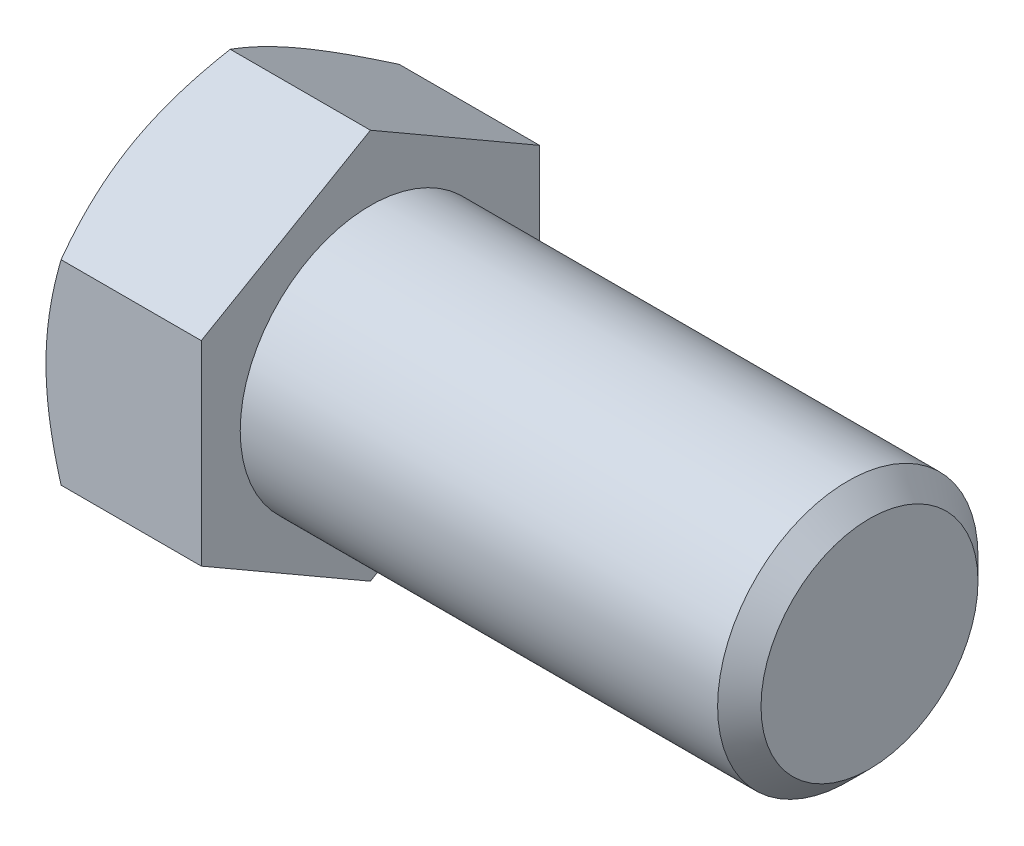
ISO-10303-21;
HEADER;
FILE_DESCRIPTION(('STEP AP214'),'2;1');
FILE_NAME('part.step','',(''),(''),'','','');
FILE_SCHEMA(('AUTOMOTIVE_DESIGN { 1 0 10303 214 1 1 1 1 }'));
ENDSEC;
DATA;
#1=APPLICATION_CONTEXT('core data for automotive mechanical design processes');
#2=APPLICATION_PROTOCOL_DEFINITION('international standard','automotive_design',2000,#1);
#3=PRODUCT_CONTEXT('',#1,'mechanical');
#4=PRODUCT('Part','Part','',(#3));
#5=PRODUCT_RELATED_PRODUCT_CATEGORY('part','',(#4));
#6=PRODUCT_DEFINITION_FORMATION('','',#4);
#7=PRODUCT_DEFINITION_CONTEXT('part definition',#1,'design');
#8=PRODUCT_DEFINITION('design','',#6,#7);
#9=PRODUCT_DEFINITION_SHAPE('','',#8);
#10=(LENGTH_UNIT() NAMED_UNIT(*) SI_UNIT(.MILLI.,.METRE.));
#11=(NAMED_UNIT(*) PLANE_ANGLE_UNIT() SI_UNIT($,.RADIAN.));
#12=(NAMED_UNIT(*) SI_UNIT($,.STERADIAN.) SOLID_ANGLE_UNIT());
#13=UNCERTAINTY_MEASURE_WITH_UNIT(LENGTH_MEASURE(1.E-05),#10,'distance_accuracy_value','');
#14=(GEOMETRIC_REPRESENTATION_CONTEXT(3) GLOBAL_UNCERTAINTY_ASSIGNED_CONTEXT((#13)) GLOBAL_UNIT_ASSIGNED_CONTEXT((#10,
#11,#12)) REPRESENTATION_CONTEXT('',''));
#15=CARTESIAN_POINT('',(0.,0.,0.));
#16=DIRECTION('',(0.,0.,1.));
#17=DIRECTION('',(1.,0.,0.));
#18=AXIS2_PLACEMENT_3D('',#15,#16,#17);
#19=CARTESIAN_POINT('',(0.,6.,0.));
#20=DIRECTION('',(-1.,0.,0.));
#21=DIRECTION('',(0.,0.,1.));
#22=AXIS2_PLACEMENT_3D('',#19,#20,#21);
#23=PLANE('',#22);
#24=CARTESIAN_POINT('',(0.,0.,0.));
#25=DIRECTION('',(-1.,0.,0.));
#26=DIRECTION('',(0.,0.,1.));
#27=AXIS2_PLACEMENT_3D('',#24,#25,#26);
#28=CIRCLE('',#27,6.);
#29=CARTESIAN_POINT('',(0.,0.,6.));
#30=VERTEX_POINT('',#29);
#31=EDGE_CURVE('E161',#30,#30,#28,.T.);
#32=ORIENTED_EDGE('',*,*,#31,.T.);
#33=EDGE_LOOP('',(#32));
#34=FACE_BOUND('',#33,.T.);
#35=DIRECTION('',(0.,0.5,0.866025403784439));
#36=VECTOR('',#35,1.);
#37=CARTESIAN_POINT('',(0.,4.5,-7.79422863405994));
#38=LINE('',#37,#36);
#39=CARTESIAN_POINT('',(0.,4.5,-7.79422863405994));
#40=VERTEX_POINT('',#39);
#41=CARTESIAN_POINT('',(0.,9.,0.));
#42=VERTEX_POINT('',#41);
#43=EDGE_CURVE('E143',#40,#42,#38,.T.);
#44=ORIENTED_EDGE('',*,*,#43,.T.);
#45=DIRECTION('',(0.,-0.5,0.866025403784438));
#46=VECTOR('',#45,1.);
#47=CARTESIAN_POINT('',(0.,9.,0.));
#48=LINE('',#47,#46);
#49=CARTESIAN_POINT('',(0.,4.49999999999999,7.79422863405995));
#50=VERTEX_POINT('',#49);
#51=EDGE_CURVE('E141',#42,#50,#48,.T.);
#52=ORIENTED_EDGE('',*,*,#51,.T.);
#53=DIRECTION('',(0.,-1.,0.));
#54=VECTOR('',#53,1.);
#55=CARTESIAN_POINT('',(0.,4.49999999999999,7.79422863405994));
#56=LINE('',#55,#54);
#57=CARTESIAN_POINT('',(0.,-4.5,7.79422863405994));
#58=VERTEX_POINT('',#57);
#59=EDGE_CURVE('E83',#50,#58,#56,.T.);
#60=ORIENTED_EDGE('',*,*,#59,.T.);
#61=DIRECTION('',(0.,-0.5,-0.866025403784439));
#62=VECTOR('',#61,1.);
#63=CARTESIAN_POINT('',(0.,-4.5,7.79422863405994));
#64=LINE('',#63,#62);
#65=CARTESIAN_POINT('',(0.,-9.,0.));
#66=VERTEX_POINT('',#65);
#67=EDGE_CURVE('E131',#58,#66,#64,.T.);
#68=ORIENTED_EDGE('',*,*,#67,.T.);
#69=DIRECTION('',(0.,0.5,-0.866025403784439));
#70=VECTOR('',#69,1.);
#71=CARTESIAN_POINT('',(0.,-9.,0.));
#72=LINE('',#71,#70);
#73=CARTESIAN_POINT('',(0.,-4.5,-7.79422863405994));
#74=VERTEX_POINT('',#73);
#75=EDGE_CURVE('E137',#66,#74,#72,.T.);
#76=ORIENTED_EDGE('',*,*,#75,.T.);
#77=DIRECTION('',(0.,1.,0.));
#78=VECTOR('',#77,1.);
#79=CARTESIAN_POINT('',(0.,-4.5,-7.79422863405994));
#80=LINE('',#79,#78);
#81=EDGE_CURVE('E148',#74,#40,#80,.T.);
#82=ORIENTED_EDGE('',*,*,#81,.T.);
#83=EDGE_LOOP('',(#44,#52,#60,#68,#76,#82));
#84=FACE_BOUND('',#83,.T.);
#85=ADVANCED_FACE('F68',(#34,#84),#23,.F.);
#86=CARTESIAN_POINT('',(23.,0.,0.));
#87=DIRECTION('',(-1.,0.,0.));
#88=DIRECTION('',(0.,0.,1.));
#89=AXIS2_PLACEMENT_3D('',#86,#87,#88);
#90=PLANE('',#89);
#91=CARTESIAN_POINT('',(23.,0.,0.));
#92=DIRECTION('',(-1.,0.,0.));
#93=DIRECTION('',(0.,0.,1.));
#94=AXIS2_PLACEMENT_3D('',#91,#92,#93);
#95=CIRCLE('',#94,4.99999999999999);
#96=CARTESIAN_POINT('',(23.,0.,4.99999999999999));
#97=VERTEX_POINT('',#96);
#98=EDGE_CURVE('E13',#97,#97,#95,.F.);
#99=ORIENTED_EDGE('',*,*,#98,.T.);
#100=EDGE_LOOP('',(#99));
#101=FACE_BOUND('',#100,.T.);
#102=ADVANCED_FACE('F217',(#101),#90,.F.);
#103=CARTESIAN_POINT('',(0.,0.,0.));
#104=DIRECTION('',(-1.,0.,0.));
#105=DIRECTION('',(0.,0.,1.));
#106=AXIS2_PLACEMENT_3D('',#103,#104,#105);
#107=CYLINDRICAL_SURFACE('',#106,6.);
#108=CARTESIAN_POINT('',(22.,0.,0.));
#109=DIRECTION('',(-1.,0.,0.));
#110=DIRECTION('',(0.,0.,1.));
#111=AXIS2_PLACEMENT_3D('',#108,#109,#110);
#112=CIRCLE('',#111,6.);
#113=CARTESIAN_POINT('',(22.,0.,6.));
#114=VERTEX_POINT('',#113);
#115=EDGE_CURVE('E76',#114,#114,#112,.T.);
#116=ORIENTED_EDGE('',*,*,#115,.T.);
#117=EDGE_LOOP('',(#116));
#118=FACE_BOUND('',#117,.T.);
#119=ORIENTED_EDGE('',*,*,#31,.F.);
#120=EDGE_LOOP('',(#119));
#121=FACE_BOUND('',#120,.T.);
#122=ADVANCED_FACE('F190',(#118,#121),#107,.T.);
#123=CARTESIAN_POINT('',(-10.,4.5,-7.79422863405994));
#124=DIRECTION('',(0.,0.866025403784438,-0.5));
#125=DIRECTION('',(0.,0.5,0.866025403784438));
#126=AXIS2_PLACEMENT_3D('',#123,#124,#125);
#127=PLANE('',#126);
#128=CARTESIAN_POINT('',(-6.46070284750902,4.49988452994616,-7.79442863405994));
#129=CARTESIAN_POINT('',(-6.51780260079582,4.59879950870639,-7.62310286521763));
#130=CARTESIAN_POINT('',(-6.57231094880739,4.69808327761291,-7.45113833310461));
#131=CARTESIAN_POINT('',(-6.67543107497447,4.89745710466197,-7.10581273495618));
#132=CARTESIAN_POINT('',(-6.72404030943128,4.99754749092025,-6.93245110060765));
#133=CARTESIAN_POINT('',(-6.86006515841878,5.29942124506401,-6.40959042095911));
#134=CARTESIAN_POINT('',(-6.9374343657416,5.5023962443257,-6.0580274095716));
#135=CARTESIAN_POINT('',(-7.02815896377191,5.80614440853671,-5.53192015645236));
#136=CARTESIAN_POINT('',(-7.05400379366982,5.90601013280876,-5.35894764807851));
#137=CARTESIAN_POINT('',(-7.09734123100484,6.10619320539383,-5.01222039554591));
#138=CARTESIAN_POINT('',(-7.1148345763996,6.20651051301283,-4.83846572187129));
#139=CARTESIAN_POINT('',(-7.14102570281816,6.40731786054443,-4.49065719341342));
#140=CARTESIAN_POINT('',(-7.14973346561756,6.50780757419777,-4.31660390372779));
#141=CARTESIAN_POINT('',(-7.15816674191882,6.70887983476791,-3.96833653242758));
#142=CARTESIAN_POINT('',(-7.15789253291908,6.80946237872071,-3.79412245594679));
#143=CARTESIAN_POINT('',(-7.14898658076692,6.99750527197464,-3.46842261082873));
#144=CARTESIAN_POINT('',(-7.1414412545191,7.08497889058778,-3.31691385906887));
#145=CARTESIAN_POINT('',(-7.11970366098955,7.25972156379906,-3.01425067081653));
#146=CARTESIAN_POINT('',(-7.1055109222476,7.34699060344639,-2.86309626021962));
#147=CARTESIAN_POINT('',(-7.0532971550531,7.60845956220151,-2.41021873905362));
#148=CARTESIAN_POINT('',(-7.00564707985474,7.78219665888802,-2.10929726043307));
#149=CARTESIAN_POINT('',(-6.88652096473075,8.13151383909343,-1.50426215636062));
#150=CARTESIAN_POINT('',(-6.81453994540648,8.30704934019216,-1.20022574992556));
#151=CARTESIAN_POINT('',(-6.65117273645529,8.65550262811656,-0.596686951176073));
#152=CARTESIAN_POINT('',(-6.55982491838325,8.82842487729215,-0.297176829844864));
#153=CARTESIAN_POINT('',(-6.46070284750902,9.00011547005384,0.000199999999995929));
#154=B_SPLINE_CURVE_WITH_KNOTS('',3,(#128,#129,#130,#131,#132,#133,#134,#135,#136,#137,#138,
#139,#140,#141,#142,#143,#144,#145,#146,#147,#148,#149,#150,#151,#152,#153),.UNSPECIFIED.,.F.,
.F.,(4,2,2,2,2,2,2,2,2,2,2,2,4),(0.,0.617667126704347,1.23559965230367,2.47403233296679,
3.07808164625474,3.6820775743811,4.28538649467425,4.88867677573062,5.41387548857205,
5.93911145618209,6.99032972891176,8.06486213809552,9.13728513994542),.UNSPECIFIED.);
#155=CARTESIAN_POINT('',(-6.46076951545867,4.5,-7.79422863405994));
#156=VERTEX_POINT('',#155);
#157=CARTESIAN_POINT('',(-6.46076951545867,9.,0.));
#158=VERTEX_POINT('',#157);
#159=EDGE_CURVE('E193',#156,#158,#154,.T.);
#160=ORIENTED_EDGE('',*,*,#159,.T.);
#161=DIRECTION('',(1.,0.,0.));
#162=VECTOR('',#161,1.);
#163=CARTESIAN_POINT('',(-10.,9.,0.));
#164=LINE('',#163,#162);
#165=EDGE_CURVE('E91',#158,#42,#164,.T.);
#166=ORIENTED_EDGE('',*,*,#165,.T.);
#167=ORIENTED_EDGE('',*,*,#43,.F.);
#168=DIRECTION('',(1.,0.,0.));
#169=VECTOR('',#168,1.);
#170=CARTESIAN_POINT('',(-10.,4.5,-7.79422863405994));
#171=LINE('',#170,#169);
#172=EDGE_CURVE('E151',#156,#40,#171,.T.);
#173=ORIENTED_EDGE('',*,*,#172,.F.);
#174=EDGE_LOOP('',(#160,#166,#167,#173));
#175=FACE_BOUND('',#174,.T.);
#176=ADVANCED_FACE('F186',(#175),#127,.T.);
#177=CARTESIAN_POINT('',(-10.,-4.5,-7.79422863405994));
#178=DIRECTION('',(0.,0.,-1.));
#179=DIRECTION('',(-1.,0.,0.));
#180=AXIS2_PLACEMENT_3D('',#177,#178,#179);
#181=PLANE('',#180);
#182=CARTESIAN_POINT('',(-3.45013243923555,-11.8871435441502,-7.79422863405994));
#183=CARTESIAN_POINT('',(-3.61513212776838,-11.5453000884677,-7.79422863405994));
#184=CARTESIAN_POINT('',(-3.77847695237742,-11.2026430083419,-7.79422863405994));
#185=CARTESIAN_POINT('',(-4.10091009820773,-10.5152614203984,-7.79422863405994));
#186=CARTESIAN_POINT('',(-4.25999767126696,-10.1705365620552,-7.79422863405994));
#187=CARTESIAN_POINT('',(-4.57381803962259,-9.47669344952864,-7.79422863405994));
#188=CARTESIAN_POINT('',(-4.72852025123507,-9.12756131183755,-7.79422863405994));
#189=CARTESIAN_POINT('',(-5.03121102013885,-8.42640990621833,-7.79422863405994));
#190=CARTESIAN_POINT('',(-5.17919993120749,-8.0743907915851,-7.79422863405994));
#191=CARTESIAN_POINT('',(-5.46834306933042,-7.36275735143967,-7.79422863405994));
#192=CARTESIAN_POINT('',(-5.60939765906331,-7.00310231439271,-7.79422863405994));
#193=CARTESIAN_POINT('',(-5.88034043308964,-6.27953420083924,-7.79422863405994));
#194=CARTESIAN_POINT('',(-6.01022737048032,-5.91562065399723,-7.79422863405994));
#195=CARTESIAN_POINT('',(-6.25530950437768,-5.18371551170913,-7.79422863405994));
#196=CARTESIAN_POINT('',(-6.37053635584792,-4.81573463394478,-7.79422863405994));
#197=CARTESIAN_POINT('',(-6.58252747215586,-4.07455724278535,-7.79422863405994));
#198=CARTESIAN_POINT('',(-6.67929761838976,-3.70136243167834,-7.79422863405994));
#199=CARTESIAN_POINT('',(-6.84964430651716,-2.94942085934435,-7.79422863405994));
#200=CARTESIAN_POINT('',(-6.92321214920422,-2.57067207133666,-7.79422863405994));
#201=CARTESIAN_POINT('',(-7.01245142321804,-1.99925709701334,-7.79422863405994));
#202=CARTESIAN_POINT('',(-7.03868100867892,-1.80821332805513,-7.79422863405994));
#203=CARTESIAN_POINT('',(-7.08358593404042,-1.42524605558091,-7.79422863405994));
#204=CARTESIAN_POINT('',(-7.10226198765831,-1.23332263691501,-7.79422863405994));
#205=CARTESIAN_POINT('',(-7.13155940706448,-0.85004630666443,-7.79422863405994));
#206=CARTESIAN_POINT('',(-7.14222958236774,-0.658697140809862,-7.79422863405994));
#207=CARTESIAN_POINT('',(-7.15545964300746,-0.275719292023764,-7.79422863405994));
#208=CARTESIAN_POINT('',(-7.15801964934033,-0.0840906133049886,-7.79422863405994));
#209=CARTESIAN_POINT('',(-7.1549685763674,0.299049527718677,-7.79422863405994));
#210=CARTESIAN_POINT('',(-7.14935974843619,0.490561007772642,-7.79422863405994));
#211=CARTESIAN_POINT('',(-7.13010910110289,0.873182507881345,-7.79422863405994));
#212=CARTESIAN_POINT('',(-7.1164668456962,1.06429250558109,-7.79422863405994));
#213=CARTESIAN_POINT('',(-7.07382036711238,1.52887914329752,-7.79422863405994));
#214=CARTESIAN_POINT('',(-7.04071364531459,1.80198639890912,-7.79422863405994));
#215=CARTESIAN_POINT('',(-6.95994899366412,2.34602930791573,-7.79422863405994));
#216=CARTESIAN_POINT('',(-6.91228886347717,2.61696462657383,-7.79422863405994));
#217=CARTESIAN_POINT('',(-6.7498724194379,3.42700119689536,-7.79422863405994));
#218=CARTESIAN_POINT('',(-6.61578990490024,3.96227061854245,-7.79422863405994));
#219=CARTESIAN_POINT('',(-6.3849954396195,4.76285070654446,-7.79422863405994));
#220=CARTESIAN_POINT('',(-6.302005675105,5.03235421702641,-7.79422863405994));
#221=CARTESIAN_POINT('',(-6.127850360925,5.56875770212913,-7.79422863405994));
#222=CARTESIAN_POINT('',(-6.03668408016499,5.83565744156602,-7.79422863405994));
#223=CARTESIAN_POINT('',(-5.84812172876184,6.36552011623486,-7.79422863405994));
#224=CARTESIAN_POINT('',(-5.75076386407457,6.62849678660593,-7.79422863405994));
#225=CARTESIAN_POINT('',(-5.55047370592607,7.15221912679046,-7.79422863405994));
#226=CARTESIAN_POINT('',(-5.44754334298111,7.41296553345428,-7.79422863405994));
#227=CARTESIAN_POINT('',(-5.34234986747821,7.67277402949574,-7.79422863405994));
#228=B_SPLINE_CURVE_WITH_KNOTS('',3,(#182,#183,#184,#185,#186,#187,#188,#189,#190,#191,#192,
#193,#194,#195,#196,#197,#198,#199,#200,#201,#202,#203,#204,#205,#206,#207,#208,#209,#210,#211,
#212,#213,#214,#215,#216,#217,#218,#219,#220,#221,#222,#223,#224,#225,#226,#227),.UNSPECIFIED.,
.F.,.F.,(4,2,2,2,2,2,2,2,2,2,2,2,2,2,2,2,2,2,2,2,2,2,4),(0.,1.13875897147266,2.27771676946099,
3.42327579508272,4.56877438176784,5.72760998623509,6.88657481069739,8.04299304897516,
9.19904216616966,10.3555242053526,10.9339061906066,11.5122335129944,12.0870056330268,
12.6617691779371,13.2363743449013,13.811010700743,14.6358607774909,15.4608356253718,
17.1139754294432,17.9598868064326,18.8058738952383,19.6470698105752,20.4879761469829),.UNSPECIFIED.);
#229=CARTESIAN_POINT('',(-6.46076951545867,-4.5,-7.79422863405994));
#230=VERTEX_POINT('',#229);
#231=EDGE_CURVE('E198',#230,#156,#228,.T.);
#232=ORIENTED_EDGE('',*,*,#231,.T.);
#233=ORIENTED_EDGE('',*,*,#172,.T.);
#234=ORIENTED_EDGE('',*,*,#81,.F.);
#235=DIRECTION('',(1.,0.,0.));
#236=VECTOR('',#235,1.);
#237=CARTESIAN_POINT('',(-10.,-4.5,-7.79422863405994));
#238=LINE('',#237,#236);
#239=EDGE_CURVE('E154',#230,#74,#238,.T.);
#240=ORIENTED_EDGE('',*,*,#239,.F.);
#241=EDGE_LOOP('',(#232,#233,#234,#240));
#242=FACE_BOUND('',#241,.T.);
#243=ADVANCED_FACE('F189',(#242),#181,.T.);
#244=CARTESIAN_POINT('',(-10.,-9.,0.));
#245=DIRECTION('',(0.,-0.866025403784439,-0.5));
#246=DIRECTION('',(0.,0.5,-0.866025403784439));
#247=AXIS2_PLACEMENT_3D('',#244,#245,#246);
#248=PLANE('',#247);
#249=CARTESIAN_POINT('',(-6.46070284750902,-9.00011547005384,0.000200000000000963));
#250=CARTESIAN_POINT('',(-6.51780260079582,-8.9012004912936,-0.171125768842318));
#251=CARTESIAN_POINT('',(-6.57231094880739,-8.80191672238709,-0.343090300955334));
#252=CARTESIAN_POINT('',(-6.67543107497447,-8.60254289533802,-0.68841589910376));
#253=CARTESIAN_POINT('',(-6.72404030943128,-8.50245250907974,-0.861777533452293));
#254=CARTESIAN_POINT('',(-6.86006515841878,-8.20057875493599,-1.38463821310083));
#255=CARTESIAN_POINT('',(-6.9374343657416,-7.9976037556743,-1.73620122448834));
#256=CARTESIAN_POINT('',(-7.02815896377191,-7.69385559146328,-2.26230847760759));
#257=CARTESIAN_POINT('',(-7.05400379366982,-7.59398986719124,-2.43528098598144));
#258=CARTESIAN_POINT('',(-7.09734123100484,-7.39380679460616,-2.78200823851403));
#259=CARTESIAN_POINT('',(-7.1148345763996,-7.29348948698716,-2.95576291218866));
#260=CARTESIAN_POINT('',(-7.14102570281816,-7.09268213945557,-3.30357144064653));
#261=CARTESIAN_POINT('',(-7.14973346561756,-6.99219242580223,-3.47762473033216));
#262=CARTESIAN_POINT('',(-7.15816674191883,-6.79112016523209,-3.82589210163237));
#263=CARTESIAN_POINT('',(-7.15789253291908,-6.69053762127928,-4.00010617811315));
#264=CARTESIAN_POINT('',(-7.14898658076692,-6.50249472802535,-4.32580602323121));
#265=CARTESIAN_POINT('',(-7.1414412545191,-6.41502110941221,-4.47731477499107));
#266=CARTESIAN_POINT('',(-7.11970366098955,-6.24027843620093,-4.77997796324341));
#267=CARTESIAN_POINT('',(-7.1055109222476,-6.1530093965536,-4.93113237384033));
#268=CARTESIAN_POINT('',(-7.0532971550531,-5.89154043779848,-5.38400989500633));
#269=CARTESIAN_POINT('',(-7.00564707985474,-5.71780334111197,-5.68493137362687));
#270=CARTESIAN_POINT('',(-6.88652096473075,-5.36848616090657,-6.28996647769933));
#271=CARTESIAN_POINT('',(-6.81453994540648,-5.19295065980784,-6.59400288413439));
#272=CARTESIAN_POINT('',(-6.6511727364553,-4.84449737188344,-7.19754168288388));
#273=CARTESIAN_POINT('',(-6.55982491838326,-4.67157512270785,-7.49705180421509));
#274=CARTESIAN_POINT('',(-6.46070284750902,-4.49988452994616,-7.79442863405994));
#275=B_SPLINE_CURVE_WITH_KNOTS('',3,(#249,#250,#251,#252,#253,#254,#255,#256,#257,#258,#259,
#260,#261,#262,#263,#264,#265,#266,#267,#268,#269,#270,#271,#272,#273,#274),.UNSPECIFIED.,.F.,
.F.,(4,2,2,2,2,2,2,2,2,2,2,2,4),(0.,0.617667126704347,1.23559965230367,2.47403233296679,
3.07808164625474,3.6820775743811,4.28538649467426,4.88867677573062,5.41387548857205,
5.93911145618209,6.99032972891176,8.06486213809553,9.13728513994542),.UNSPECIFIED.);
#276=CARTESIAN_POINT('',(-6.46076951545867,-9.,0.));
#277=VERTEX_POINT('',#276);
#278=EDGE_CURVE('E241',#277,#230,#275,.T.);
#279=ORIENTED_EDGE('',*,*,#278,.T.);
#280=ORIENTED_EDGE('',*,*,#239,.T.);
#281=ORIENTED_EDGE('',*,*,#75,.F.);
#282=DIRECTION('',(1.,0.,0.));
#283=VECTOR('',#282,1.);
#284=CARTESIAN_POINT('',(-10.,-9.,0.));
#285=LINE('',#284,#283);
#286=EDGE_CURVE('E127',#277,#66,#285,.T.);
#287=ORIENTED_EDGE('',*,*,#286,.F.);
#288=EDGE_LOOP('',(#279,#280,#281,#287));
#289=FACE_BOUND('',#288,.T.);
#290=ADVANCED_FACE('F251',(#289),#248,.T.);
#291=CARTESIAN_POINT('',(-10.,-4.5,7.79422863405994));
#292=DIRECTION('',(0.,-0.866025403784439,0.5));
#293=DIRECTION('',(0.,-0.5,-0.866025403784439));
#294=AXIS2_PLACEMENT_3D('',#291,#292,#293);
#295=PLANE('',#294);
#296=CARTESIAN_POINT('',(-6.46070284750902,-4.49988452994616,7.79442863405994));
#297=CARTESIAN_POINT('',(-6.51780260079582,-4.5987995087064,7.62310286521762));
#298=CARTESIAN_POINT('',(-6.57231094880739,-4.69808327761291,7.45113833310461));
#299=CARTESIAN_POINT('',(-6.67543107497447,-4.89745710466198,7.10581273495618));
#300=CARTESIAN_POINT('',(-6.72404030943128,-4.99754749092025,6.93245110060765));
#301=CARTESIAN_POINT('',(-6.86006515841878,-5.29942124506401,6.40959042095911));
#302=CARTESIAN_POINT('',(-6.9374343657416,-5.5023962443257,6.0580274095716));
#303=CARTESIAN_POINT('',(-7.02815896377191,-5.80614440853672,5.53192015645235));
#304=CARTESIAN_POINT('',(-7.05400379366982,-5.90601013280876,5.35894764807851));
#305=CARTESIAN_POINT('',(-7.09734123100484,-6.10619320539383,5.01222039554591));
#306=CARTESIAN_POINT('',(-7.1148345763996,-6.20651051301284,4.83846572187128));
#307=CARTESIAN_POINT('',(-7.14102570281816,-6.40731786054443,4.49065719341342));
#308=CARTESIAN_POINT('',(-7.14973346561756,-6.50780757419777,4.31660390372779));
#309=CARTESIAN_POINT('',(-7.15816674191882,-6.70887983476791,3.96833653242757));
#310=CARTESIAN_POINT('',(-7.15789253291908,-6.80946237872071,3.79412245594679));
#311=CARTESIAN_POINT('',(-7.14898658076692,-6.99750527197464,3.46842261082873));
#312=CARTESIAN_POINT('',(-7.1414412545191,-7.08497889058778,3.31691385906887));
#313=CARTESIAN_POINT('',(-7.11970366098955,-7.25972156379906,3.01425067081653));
#314=CARTESIAN_POINT('',(-7.1055109222476,-7.34699060344639,2.86309626021962));
#315=CARTESIAN_POINT('',(-7.0532971550531,-7.60845956220151,2.41021873905362));
#316=CARTESIAN_POINT('',(-7.00564707985474,-7.78219665888803,2.10929726043307));
#317=CARTESIAN_POINT('',(-6.88652096473075,-8.13151383909343,1.50426215636062));
#318=CARTESIAN_POINT('',(-6.81453994540648,-8.30704934019216,1.20022574992555));
#319=CARTESIAN_POINT('',(-6.65117273645529,-8.65550262811656,0.596686951176069));
#320=CARTESIAN_POINT('',(-6.55982491838325,-8.82842487729215,0.29717682984486));
#321=CARTESIAN_POINT('',(-6.46070284750902,-9.00011547005384,-0.000199999999998984));
#322=B_SPLINE_CURVE_WITH_KNOTS('',3,(#296,#297,#298,#299,#300,#301,#302,#303,#304,#305,#306,
#307,#308,#309,#310,#311,#312,#313,#314,#315,#316,#317,#318,#319,#320,#321),.UNSPECIFIED.,.F.,
.F.,(4,2,2,2,2,2,2,2,2,2,2,2,4),(0.,0.617667126704348,1.23559965230367,2.47403233296679,
3.07808164625474,3.6820775743811,4.28538649467425,4.88867677573062,5.41387548857205,
5.93911145618209,6.99032972891176,8.06486213809553,9.13728513994542),.UNSPECIFIED.);
#323=CARTESIAN_POINT('',(-6.46076951545867,-4.5,7.79422863405994));
#324=VERTEX_POINT('',#323);
#325=EDGE_CURVE('E242',#324,#277,#322,.T.);
#326=ORIENTED_EDGE('',*,*,#325,.T.);
#327=ORIENTED_EDGE('',*,*,#286,.T.);
#328=ORIENTED_EDGE('',*,*,#67,.F.);
#329=DIRECTION('',(1.,0.,0.));
#330=VECTOR('',#329,1.);
#331=CARTESIAN_POINT('',(-10.,-4.5,7.79422863405994));
#332=LINE('',#331,#330);
#333=EDGE_CURVE('E120',#324,#58,#332,.T.);
#334=ORIENTED_EDGE('',*,*,#333,.F.);
#335=EDGE_LOOP('',(#326,#327,#328,#334));
#336=FACE_BOUND('',#335,.T.);
#337=ADVANCED_FACE('F132',(#336),#295,.T.);
#338=CARTESIAN_POINT('',(-10.,4.49999999999999,7.79422863405994));
#339=DIRECTION('',(0.,0.,1.));
#340=DIRECTION('',(1.,0.,0.));
#341=AXIS2_PLACEMENT_3D('',#338,#339,#340);
#342=PLANE('',#341);
#343=CARTESIAN_POINT('',(-3.45013243923555,-11.8871435441502,7.79422863405994));
#344=CARTESIAN_POINT('',(-3.61513212776838,-11.5453000884677,7.79422863405994));
#345=CARTESIAN_POINT('',(-3.77847695237741,-11.2026430083419,7.79422863405994));
#346=CARTESIAN_POINT('',(-4.10091009820773,-10.5152614203984,7.79422863405994));
#347=CARTESIAN_POINT('',(-4.25999767126696,-10.1705365620552,7.79422863405994));
#348=CARTESIAN_POINT('',(-4.57381803962259,-9.47669344952864,7.79422863405994));
#349=CARTESIAN_POINT('',(-4.72852025123507,-9.12756131183755,7.79422863405994));
#350=CARTESIAN_POINT('',(-5.03121102013885,-8.42640990621833,7.79422863405994));
#351=CARTESIAN_POINT('',(-5.17919993120749,-8.07439079158511,7.79422863405994));
#352=CARTESIAN_POINT('',(-5.46834306933042,-7.36275735143967,7.79422863405994));
#353=CARTESIAN_POINT('',(-5.60939765906331,-7.00310231439271,7.79422863405994));
#354=CARTESIAN_POINT('',(-5.88034043308964,-6.27953420083924,7.79422863405994));
#355=CARTESIAN_POINT('',(-6.01022737048032,-5.91562065399723,7.79422863405994));
#356=CARTESIAN_POINT('',(-6.25530950437768,-5.18371551170913,7.79422863405994));
#357=CARTESIAN_POINT('',(-6.37053635584792,-4.81573463394478,7.79422863405994));
#358=CARTESIAN_POINT('',(-6.58252747215586,-4.07455724278536,7.79422863405994));
#359=CARTESIAN_POINT('',(-6.67929761838976,-3.70136243167834,7.79422863405994));
#360=CARTESIAN_POINT('',(-6.84964430651716,-2.94942085934435,7.79422863405994));
#361=CARTESIAN_POINT('',(-6.92321214920422,-2.57067207133666,7.79422863405994));
#362=CARTESIAN_POINT('',(-7.01245142321804,-1.99925709701334,7.79422863405994));
#363=CARTESIAN_POINT('',(-7.03868100867892,-1.80821332805513,7.79422863405994));
#364=CARTESIAN_POINT('',(-7.08358593404042,-1.42524605558091,7.79422863405994));
#365=CARTESIAN_POINT('',(-7.10226198765831,-1.23332263691502,7.79422863405994));
#366=CARTESIAN_POINT('',(-7.13155940706448,-0.850046306664431,7.79422863405994));
#367=CARTESIAN_POINT('',(-7.14222958236775,-0.658697140809863,7.79422863405994));
#368=CARTESIAN_POINT('',(-7.15545964300747,-0.275719292023767,7.79422863405994));
#369=CARTESIAN_POINT('',(-7.15801964934033,-0.0840906133049915,7.79422863405994));
#370=CARTESIAN_POINT('',(-7.1549685763674,0.299049527718674,7.79422863405994));
#371=CARTESIAN_POINT('',(-7.14935974843619,0.49056100777264,7.79422863405994));
#372=CARTESIAN_POINT('',(-7.13010910110289,0.873182507881343,7.79422863405994));
#373=CARTESIAN_POINT('',(-7.1164668456962,1.06429250558109,7.79422863405994));
#374=CARTESIAN_POINT('',(-7.07382036711238,1.52887914329752,7.79422863405994));
#375=CARTESIAN_POINT('',(-7.0407136453146,1.80198639890912,7.79422863405994));
#376=CARTESIAN_POINT('',(-6.95994899366412,2.34602930791573,7.79422863405994));
#377=CARTESIAN_POINT('',(-6.91228886347718,2.61696462657383,7.79422863405994));
#378=CARTESIAN_POINT('',(-6.7498724194379,3.42700119689536,7.79422863405994));
#379=CARTESIAN_POINT('',(-6.61578990490024,3.96227061854246,7.79422863405994));
#380=CARTESIAN_POINT('',(-6.3849954396195,4.76285070654446,7.79422863405994));
#381=CARTESIAN_POINT('',(-6.302005675105,5.03235421702641,7.79422863405994));
#382=CARTESIAN_POINT('',(-6.127850360925,5.56875770212913,7.79422863405994));
#383=CARTESIAN_POINT('',(-6.03668408016499,5.83565744156602,7.79422863405994));
#384=CARTESIAN_POINT('',(-5.84812172876184,6.36552011623486,7.79422863405994));
#385=CARTESIAN_POINT('',(-5.75076386407457,6.62849678660593,7.79422863405994));
#386=CARTESIAN_POINT('',(-5.55047370592607,7.15221912679046,7.79422863405994));
#387=CARTESIAN_POINT('',(-5.44754334298111,7.41296553345428,7.79422863405994));
#388=CARTESIAN_POINT('',(-5.34234986747821,7.67277402949574,7.79422863405994));
#389=B_SPLINE_CURVE_WITH_KNOTS('',3,(#343,#344,#345,#346,#347,#348,#349,#350,#351,#352,#353,
#354,#355,#356,#357,#358,#359,#360,#361,#362,#363,#364,#365,#366,#367,#368,#369,#370,#371,#372,
#373,#374,#375,#376,#377,#378,#379,#380,#381,#382,#383,#384,#385,#386,#387,#388),.UNSPECIFIED.,
.F.,.F.,(4,2,2,2,2,2,2,2,2,2,2,2,2,2,2,2,2,2,2,2,2,2,4),(0.,1.13875897147266,2.27771676946099,
3.42327579508272,4.56877438176784,5.72760998623509,6.88657481069739,8.04299304897516,
9.19904216616966,10.3555242053526,10.9339061906066,11.5122335129944,12.0870056330268,
12.6617691779371,13.2363743449013,13.811010700743,14.6358607774909,15.4608356253719,
17.1139754294432,17.9598868064326,18.8058738952383,19.6470698105752,20.4879761469829),.UNSPECIFIED.);
#390=CARTESIAN_POINT('',(-6.46076951545867,4.49999999999999,7.79422863405994));
#391=VERTEX_POINT('',#390);
#392=EDGE_CURVE('E124',#391,#324,#389,.F.);
#393=ORIENTED_EDGE('',*,*,#392,.T.);
#394=ORIENTED_EDGE('',*,*,#333,.T.);
#395=ORIENTED_EDGE('',*,*,#59,.F.);
#396=DIRECTION('',(1.,0.,0.));
#397=VECTOR('',#396,1.);
#398=CARTESIAN_POINT('',(-10.,4.49999999999999,7.79422863405994));
#399=LINE('',#398,#397);
#400=EDGE_CURVE('E128',#391,#50,#399,.T.);
#401=ORIENTED_EDGE('',*,*,#400,.F.);
#402=EDGE_LOOP('',(#393,#394,#395,#401));
#403=FACE_BOUND('',#402,.T.);
#404=ADVANCED_FACE('F122',(#403),#342,.T.);
#405=CARTESIAN_POINT('',(-10.,9.,0.));
#406=DIRECTION('',(0.,0.866025403784438,0.5));
#407=DIRECTION('',(0.,-0.5,0.866025403784438));
#408=AXIS2_PLACEMENT_3D('',#405,#406,#407);
#409=PLANE('',#408);
#410=CARTESIAN_POINT('',(-6.46070284750902,9.00011547005384,-0.000200000000003088));
#411=CARTESIAN_POINT('',(-6.51780260079582,8.9012004912936,0.171125768842316));
#412=CARTESIAN_POINT('',(-6.57231094880739,8.80191672238709,0.343090300955332));
#413=CARTESIAN_POINT('',(-6.67543107497447,8.60254289533802,0.688415899103758));
#414=CARTESIAN_POINT('',(-6.72404030943128,8.50245250907974,0.861777533452291));
#415=CARTESIAN_POINT('',(-6.86006515841878,8.20057875493599,1.38463821310083));
#416=CARTESIAN_POINT('',(-6.9374343657416,7.99760375567429,1.73620122448834));
#417=CARTESIAN_POINT('',(-7.02815896377191,7.69385559146328,2.26230847760759));
#418=CARTESIAN_POINT('',(-7.05400379366982,7.59398986719124,2.43528098598143));
#419=CARTESIAN_POINT('',(-7.09734123100484,7.39380679460616,2.78200823851403));
#420=CARTESIAN_POINT('',(-7.1148345763996,7.29348948698716,2.95576291218866));
#421=CARTESIAN_POINT('',(-7.14102570281816,7.09268213945556,3.30357144064652));
#422=CARTESIAN_POINT('',(-7.14973346561756,6.99219242580223,3.47762473033215));
#423=CARTESIAN_POINT('',(-7.15816674191883,6.79112016523208,3.82589210163237));
#424=CARTESIAN_POINT('',(-7.15789253291908,6.69053762127928,4.00010617811315));
#425=CARTESIAN_POINT('',(-7.14898658076692,6.50249472802535,4.32580602323121));
#426=CARTESIAN_POINT('',(-7.1414412545191,6.41502110941221,4.47731477499107));
#427=CARTESIAN_POINT('',(-7.11970366098956,6.24027843620093,4.77997796324341));
#428=CARTESIAN_POINT('',(-7.1055109222476,6.1530093965536,4.93113237384033));
#429=CARTESIAN_POINT('',(-7.0532971550531,5.89154043779848,5.38400989500632));
#430=CARTESIAN_POINT('',(-7.00564707985474,5.71780334111197,5.68493137362687));
#431=CARTESIAN_POINT('',(-6.88652096473075,5.36848616090657,6.28996647769932));
#432=CARTESIAN_POINT('',(-6.81453994540649,5.19295065980783,6.59400288413439));
#433=CARTESIAN_POINT('',(-6.6511727364553,4.84449737188344,7.19754168288387));
#434=CARTESIAN_POINT('',(-6.55982491838326,4.67157512270784,7.49705180421508));
#435=CARTESIAN_POINT('',(-6.46070284750902,4.49988452994616,7.79442863405994));
#436=B_SPLINE_CURVE_WITH_KNOTS('',3,(#410,#411,#412,#413,#414,#415,#416,#417,#418,#419,#420,
#421,#422,#423,#424,#425,#426,#427,#428,#429,#430,#431,#432,#433,#434,#435),.UNSPECIFIED.,.F.,
.F.,(4,2,2,2,2,2,2,2,2,2,2,2,4),(0.,0.617667126704347,1.23559965230367,2.47403233296679,
3.07808164625474,3.6820775743811,4.28538649467425,4.88867677573062,5.41387548857205,
5.93911145618209,6.99032972891177,8.06486213809553,9.13728513994542),.UNSPECIFIED.);
#437=EDGE_CURVE('E164',#158,#391,#436,.T.);
#438=ORIENTED_EDGE('',*,*,#437,.T.);
#439=ORIENTED_EDGE('',*,*,#400,.T.);
#440=ORIENTED_EDGE('',*,*,#51,.F.);
#441=ORIENTED_EDGE('',*,*,#165,.F.);
#442=EDGE_LOOP('',(#438,#439,#440,#441));
#443=FACE_BOUND('',#442,.T.);
#444=ADVANCED_FACE('F180',(#443),#409,.T.);
#445=CARTESIAN_POINT('',(-7.5,7.2,0.));
#446=DIRECTION('',(1.,0.,0.));
#447=DIRECTION('',(0.,0.,-1.));
#448=AXIS2_PLACEMENT_3D('',#445,#446,#447);
#449=PLANE('',#448);
#450=CARTESIAN_POINT('',(-7.5,0.,0.));
#451=DIRECTION('',(-1.,0.,0.));
#452=DIRECTION('',(0.,0.,1.));
#453=AXIS2_PLACEMENT_3D('',#450,#451,#452);
#454=CIRCLE('',#453,7.2);
#455=CARTESIAN_POINT('',(-7.5,0.,7.2));
#456=VERTEX_POINT('',#455);
#457=EDGE_CURVE('E153',#456,#456,#454,.T.);
#458=ORIENTED_EDGE('',*,*,#457,.T.);
#459=EDGE_LOOP('',(#458));
#460=FACE_BOUND('',#459,.T.);
#461=ADVANCED_FACE('F183',(#460),#449,.F.);
#462=CARTESIAN_POINT('',(-6.46076951545867,0.,0.));
#463=DIRECTION('',(1.,0.,0.));
#464=DIRECTION('',(0.,0.,-1.));
#465=AXIS2_PLACEMENT_3D('',#462,#463,#464);
#466=CONICAL_SURFACE('',#465,9.,1.0471975511966);
#467=ORIENTED_EDGE('',*,*,#457,.F.);
#468=EDGE_LOOP('',(#467));
#469=FACE_BOUND('',#468,.T.);
#470=ORIENTED_EDGE('',*,*,#159,.F.);
#471=ORIENTED_EDGE('',*,*,#231,.F.);
#472=ORIENTED_EDGE('',*,*,#278,.F.);
#473=ORIENTED_EDGE('',*,*,#325,.F.);
#474=ORIENTED_EDGE('',*,*,#392,.F.);
#475=ORIENTED_EDGE('',*,*,#437,.F.);
#476=EDGE_LOOP('',(#470,#471,#472,#473,#474,#475));
#477=FACE_BOUND('',#476,.T.);
#478=ADVANCED_FACE('F176',(#469,#477),#466,.T.);
#479=CARTESIAN_POINT('',(22.,0.,0.));
#480=DIRECTION('',(-1.,0.,0.));
#481=DIRECTION('',(0.,0.,1.));
#482=AXIS2_PLACEMENT_3D('',#479,#480,#481);
#483=CONICAL_SURFACE('',#482,6.,0.785398163397451);
#484=ORIENTED_EDGE('',*,*,#98,.F.);
#485=EDGE_LOOP('',(#484));
#486=FACE_BOUND('',#485,.T.);
#487=ORIENTED_EDGE('',*,*,#115,.F.);
#488=EDGE_LOOP('',(#487));
#489=FACE_BOUND('',#488,.T.);
#490=ADVANCED_FACE('F70',(#486,#489),#483,.T.);
#491=CLOSED_SHELL('',(#85,#102,#122,#176,#243,#290,#337,#404,#444,#461,#478,#490));
#492=MANIFOLD_SOLID_BREP('B2',#491);
#493=ADVANCED_BREP_SHAPE_REPRESENTATION('',(#18,#492),#14);
#494=SHAPE_DEFINITION_REPRESENTATION(#9,#493);
ENDSEC;
END-ISO-10303-21;
